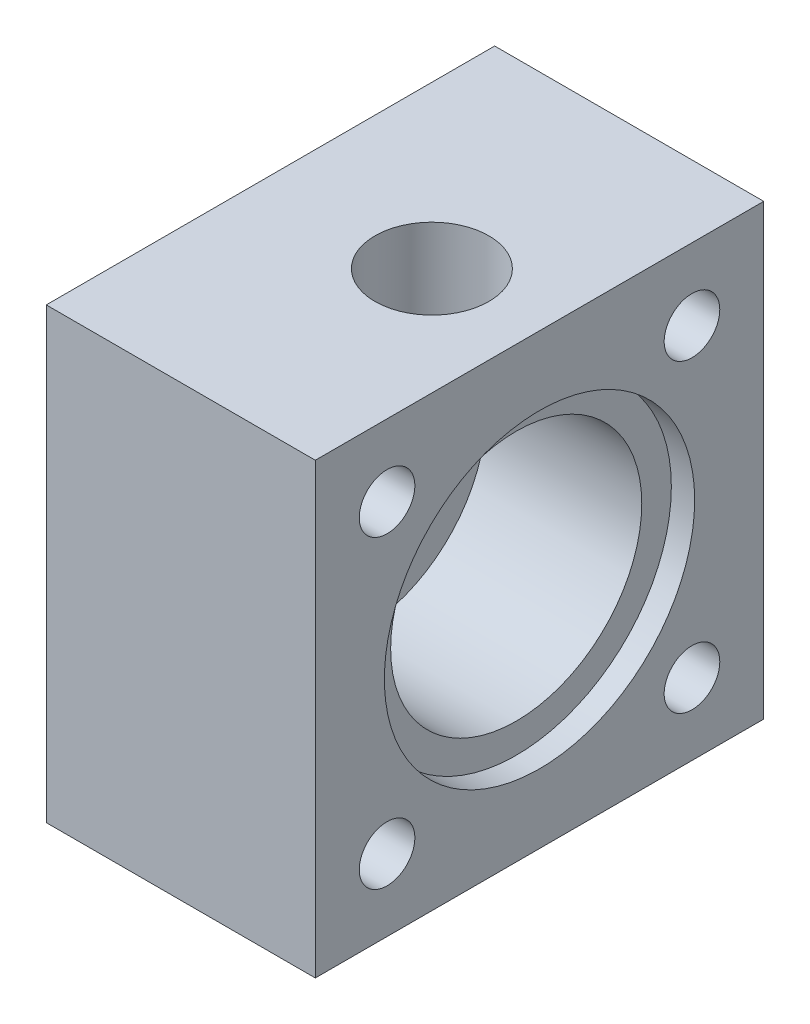
ISO-10303-21;
HEADER;
FILE_DESCRIPTION(('STEP AP214'),'2;1');
FILE_NAME('part.step','',(''),(''),'','','');
FILE_SCHEMA(('AUTOMOTIVE_DESIGN { 1 0 10303 214 1 1 1 1 }'));
ENDSEC;
DATA;
#1=APPLICATION_CONTEXT('core data for automotive mechanical design processes');
#2=APPLICATION_PROTOCOL_DEFINITION('international standard','automotive_design',2000,#1);
#3=PRODUCT_CONTEXT('',#1,'mechanical');
#4=PRODUCT('Part','Part','',(#3));
#5=PRODUCT_RELATED_PRODUCT_CATEGORY('part','',(#4));
#6=PRODUCT_DEFINITION_FORMATION('','',#4);
#7=PRODUCT_DEFINITION_CONTEXT('part definition',#1,'design');
#8=PRODUCT_DEFINITION('design','',#6,#7);
#9=PRODUCT_DEFINITION_SHAPE('','',#8);
#10=(LENGTH_UNIT() NAMED_UNIT(*) SI_UNIT(.MILLI.,.METRE.));
#11=(NAMED_UNIT(*) PLANE_ANGLE_UNIT() SI_UNIT($,.RADIAN.));
#12=(NAMED_UNIT(*) SI_UNIT($,.STERADIAN.) SOLID_ANGLE_UNIT());
#13=UNCERTAINTY_MEASURE_WITH_UNIT(LENGTH_MEASURE(1.E-05),#10,'distance_accuracy_value','');
#14=(GEOMETRIC_REPRESENTATION_CONTEXT(3) GLOBAL_UNCERTAINTY_ASSIGNED_CONTEXT((#13)) GLOBAL_UNIT_ASSIGNED_CONTEXT((#10,
#11,#12)) REPRESENTATION_CONTEXT('',''));
#15=CARTESIAN_POINT('',(0.,0.,0.));
#16=DIRECTION('',(0.,0.,1.));
#17=DIRECTION('',(1.,0.,0.));
#18=AXIS2_PLACEMENT_3D('',#15,#16,#17);
#19=CARTESIAN_POINT('',(-34.7989898732233,12.5,-12.5));
#20=DIRECTION('',(1.,0.,0.));
#21=DIRECTION('',(0.,0.,-1.));
#22=AXIS2_PLACEMENT_3D('',#19,#20,#21);
#23=CYLINDRICAL_SURFACE('',#22,7.);
#24=CARTESIAN_POINT('',(-10.,12.5,-12.5));
#25=DIRECTION('',(-1.,0.,0.));
#26=DIRECTION('',(0.,0.,1.));
#27=AXIS2_PLACEMENT_3D('',#24,#25,#26);
#28=CIRCLE('',#27,7.);
#29=CARTESIAN_POINT('',(-10.,12.5,-5.5));
#30=VERTEX_POINT('',#29);
#31=EDGE_CURVE('E114',#30,#30,#28,.F.);
#32=ORIENTED_EDGE('',*,*,#31,.F.);
#33=EDGE_LOOP('',(#32));
#34=FACE_BOUND('',#33,.T.);
#35=CARTESIAN_POINT('',(-6.,18.7385394925415,-9.325));
#36=CARTESIAN_POINT('',(-5.91610386799211,18.7385406364684,-9.32500112562036));
#37=CARTESIAN_POINT('',(-5.83218366648935,18.740239643632,-9.32833232458642));
#38=CARTESIAN_POINT('',(-5.66498876648413,18.7469672311146,-9.34160729198387));
#39=CARTESIAN_POINT('',(-5.58171446714393,18.7519977265059,-9.35155486378494));
#40=CARTESIAN_POINT('',(-5.3335176981197,18.7718812218528,-9.39122945818825));
#41=CARTESIAN_POINT('',(-5.17042631903366,18.7915256274184,-9.4307880234478));
#42=CARTESIAN_POINT('',(-4.85475304627355,18.8408699223888,-9.53409943967778));
#43=CARTESIAN_POINT('',(-4.70212664919569,18.8705235827429,-9.59774121995534));
#44=CARTESIAN_POINT('',(-4.40971778965708,18.9364644529988,-9.7470790786203));
#45=CARTESIAN_POINT('',(-4.26993392501944,18.9727509374174,-9.8327727454401));
#46=CARTESIAN_POINT('',(-3.99680023929415,19.0508698068265,-10.0305603049041));
#47=CARTESIAN_POINT('',(-3.86451538916021,19.0929110483799,-10.1440421168656));
#48=CARTESIAN_POINT('',(-3.62004797883896,19.17610051866,-10.3912818556442));
#49=CARTESIAN_POINT('',(-3.50787405153648,19.217248357252,-10.5250484447138));
#50=CARTESIAN_POINT('',(-3.30102233361556,19.2966345342633,-10.8177631858517));
#51=CARTESIAN_POINT('',(-3.20758946319898,19.3346024591903,-10.9776711557389));
#52=CARTESIAN_POINT('',(-3.04942348909177,19.4007315468161,-11.3129747107527));
#53=CARTESIAN_POINT('',(-2.98467540045025,19.428897828247,-11.4883621518272));
#54=CARTESIAN_POINT('',(-2.88972322988133,19.4707598978747,-11.8384268062081));
#55=CARTESIAN_POINT('',(-2.85767087726434,19.4852261303561,-12.0125085886879));
#56=CARTESIAN_POINT('',(-2.82299918451949,19.5008895164648,-12.3641382467761));
#57=CARTESIAN_POINT('',(-2.82036552189445,19.5020931269994,-12.5416843935776));
#58=CARTESIAN_POINT('',(-2.84374401253563,19.4915126893525,-12.8815749194122));
#59=CARTESIAN_POINT('',(-2.86771083653734,19.4806559188818,-13.0440947132053));
#60=CARTESIAN_POINT('',(-2.940039272224,19.4485026600832,-13.3625115876838));
#61=CARTESIAN_POINT('',(-2.9884026925936,19.4272053977343,-13.5184081764171));
#62=CARTESIAN_POINT('',(-3.1086471641424,19.3757768892173,-13.8220375228446));
#63=CARTESIAN_POINT('',(-3.18087328586855,19.3455167413511,-13.9696108874705));
#64=CARTESIAN_POINT('',(-3.34641033896809,19.2790245180445,-14.2509287404489));
#65=CARTESIAN_POINT('',(-3.43972899070373,19.2427902572553,-14.3846681390518));
#66=CARTESIAN_POINT('',(-3.65357527259835,19.1644131502193,-14.6460899148341));
#67=CARTESIAN_POINT('',(-3.77569760019884,19.1220294341126,-14.7723972311322));
#68=CARTESIAN_POINT('',(-4.03929871950584,19.0382044482584,-15.0034005259758));
#69=CARTESIAN_POINT('',(-4.18078786350579,18.9967636964715,-15.1080848706277));
#70=CARTESIAN_POINT('',(-4.4870057242652,18.917610515096,-15.2973717185897));
#71=CARTESIAN_POINT('',(-4.65249222905497,18.8801487316257,-15.3808626919477));
#72=CARTESIAN_POINT('',(-4.99731081529836,18.8163439138495,-15.5182113357399));
#73=CARTESIAN_POINT('',(-5.17663075974563,18.7899912611018,-15.572094653218));
#74=CARTESIAN_POINT('',(-5.53022012711717,18.7539138983809,-15.6448539421725));
#75=CARTESIAN_POINT('',(-5.70391416777173,18.7431227935664,-15.6659834164037));
#76=CARTESIAN_POINT('',(-6.05266434981633,18.7363304782862,-15.679349200102));
#77=CARTESIAN_POINT('',(-6.22771981468346,18.7403223386597,-15.6715990461925));
#78=CARTESIAN_POINT('',(-6.55902987896893,18.7615292398175,-15.6294898173899));
#79=CARTESIAN_POINT('',(-6.71564944458995,18.7776336545618,-15.5973637493863));
#80=CARTESIAN_POINT('',(-7.02108053579204,18.8197363500594,-15.5105220536069));
#81=CARTESIAN_POINT('',(-7.16988998074548,18.8457372521806,-15.4558004404282));
#82=CARTESIAN_POINT('',(-7.46306251437412,18.9061212395072,-15.3226174369645));
#83=CARTESIAN_POINT('',(-7.60691816444415,18.9408308992331,-15.2431922495724));
#84=CARTESIAN_POINT('',(-7.88002410284549,19.0143327949822,-15.0637591962524));
#85=CARTESIAN_POINT('',(-8.00926732061615,19.0531269900169,-14.9637414316042));
#86=CARTESIAN_POINT('',(-8.2629307228661,19.1350890885046,-14.7342459614232));
#87=CARTESIAN_POINT('',(-8.38558398518052,19.1783072815864,-14.6028248574766));
#88=CARTESIAN_POINT('',(-8.60751480634046,19.2607602285221,-14.3203708370364));
#89=CARTESIAN_POINT('',(-8.70678844033369,19.2999943129164,-14.1693346342536));
#90=CARTESIAN_POINT('',(-8.87982886419251,19.3706966681239,-13.8493091742254));
#91=CARTESIAN_POINT('',(-8.95330557979237,19.4020755507306,-13.6801420382315));
#92=CARTESIAN_POINT('',(-9.07012358497685,19.4528585507108,-13.3300323772761));
#93=CARTESIAN_POINT('',(-9.11348648763201,19.4722712552371,-13.1490983997421));
#94=CARTESIAN_POINT('',(-9.16577144429048,19.495784227885,-12.7962258408131));
#95=CARTESIAN_POINT('',(-9.17717191704843,19.5009855484988,-12.6247260939098));
#96=CARTESIAN_POINT('',(-9.17214655415366,19.4987053428124,-12.2822418660013));
#97=CARTESIAN_POINT('',(-9.15572736258157,19.4912268447921,-12.1112572717335));
#98=CARTESIAN_POINT('',(-9.09728626346678,19.4650504443428,-11.7831280972855));
#99=CARTESIAN_POINT('',(-9.05651933698908,19.4469031302979,-11.625712061006));
#100=CARTESIAN_POINT('',(-8.95204028870164,19.401572915061,-11.3200943674524));
#101=CARTESIAN_POINT('',(-8.88832426162152,19.3743884760735,-11.1718942835021));
#102=CARTESIAN_POINT('',(-8.7365710579261,19.3119893517679,-10.8813944469654));
#103=CARTESIAN_POINT('',(-8.64755455665187,19.2764641833,-10.7396748199412));
#104=CARTESIAN_POINT('',(-8.44904477283095,19.2014000666242,-10.4725586493925));
#105=CARTESIAN_POINT('',(-8.33954256605182,19.1618593725693,-10.3471692603778));
#106=CARTESIAN_POINT('',(-8.09265090867032,19.0790526965353,-10.1054853716632));
#107=CARTESIAN_POINT('',(-7.95370800294755,19.0357479510465,-9.99078875588783));
#108=CARTESIAN_POINT('',(-7.657344082036,18.9533704671999,-9.78591699877615));
#109=CARTESIAN_POINT('',(-7.49991104957123,18.9143005132266,-9.69575793278194));
#110=CARTESIAN_POINT('',(-7.25223626870396,18.8624560483138,-9.58093656326706));
#111=CARTESIAN_POINT('',(-7.16736105256389,18.8462455635954,-9.54595832085574));
#112=CARTESIAN_POINT('',(-6.99446478255547,18.8167316111232,-9.48336256593609));
#113=CARTESIAN_POINT('',(-6.90644534016596,18.8034266783994,-9.4557413424922));
#114=CARTESIAN_POINT('',(-6.72815299001454,18.7802695855887,-9.40825113348351));
#115=CARTESIAN_POINT('',(-6.63788665669752,18.7704083881858,-9.38836184140396));
#116=CARTESIAN_POINT('',(-6.4556803418493,18.7545023407205,-9.35651136257029));
#117=CARTESIAN_POINT('',(-6.36374165603336,18.7484546555864,-9.34454428588922));
#118=CARTESIAN_POINT('',(-6.22629958415082,18.7424794534841,-9.33275112222099));
#119=CARTESIAN_POINT('',(-6.18110468408352,18.7410037484791,-9.32984590519436));
#120=CARTESIAN_POINT('',(-6.09060886507535,18.7390334420233,-9.32597000642801));
#121=CARTESIAN_POINT('',(-6.04530794249459,18.738538874766,-9.32499939211092));
#122=CARTESIAN_POINT('',(-6.,18.7385394925415,-9.325));
#123=B_SPLINE_CURVE_WITH_KNOTS('',3,(#35,#36,#37,#38,#39,#40,#41,#42,#43,#44,#45,#46,#47,#48,
#49,#50,#51,#52,#53,#54,#55,#56,#57,#58,#59,#60,#61,#62,#63,#64,#65,#66,#67,#68,#69,#70,#71,#72,
#73,#74,#75,#76,#77,#78,#79,#80,#81,#82,#83,#84,#85,#86,#87,#88,#89,#90,#91,#92,#93,#94,#95,#96,
#97,#98,#99,#100,#101,#102,#103,#104,#105,#106,#107,#108,#109,#110,#111,#112,#113,#114,#115,
#116,#117,#118,#119,#120,#121,#122),.UNSPECIFIED.,.T.,.F.,(4,2,2,2,2,2,2,2,2,2,2,2,2,2,2,2,2,2,
2,2,2,2,2,2,2,2,2,2,2,2,2,2,2,2,2,2,2,2,2,2,2,2,2,4),(0.,0.251638222709606,0.503421222827002,
1.00759363018694,1.50946860909899,2.0112887268781,2.54685824130702,3.08265710856855,
3.64689940034438,4.21084658295613,4.74077304804067,5.27044150703138,5.76203973093057,
6.25367440568788,6.75275464672642,7.2520178595491,7.79184690713608,8.33196564885363,
8.8963139289858,9.46017257985412,9.98317854776972,10.5059394001974,10.9858533008556,
11.4658944090093,11.9676987323776,12.4697448354145,13.0218675193149,13.5740828247801,
14.1323223650903,14.6901608344807,15.203358566432,15.716433750301,16.2051037458172,
16.693856938093,17.2049704222535,17.71630708457,18.2697280583897,18.8235107281668,
19.102851596014,19.3820512942489,19.6605126897229,19.9387668243896,20.0746588199993,
20.2105555514827),.UNSPECIFIED.);
#124=CARTESIAN_POINT('',(-6.,18.7385394925415,-9.325));
#125=VERTEX_POINT('',#124);
#126=EDGE_CURVE('E116',#125,#125,#123,.T.);
#127=ORIENTED_EDGE('',*,*,#126,.T.);
#128=EDGE_LOOP('',(#127));
#129=FACE_BOUND('',#128,.T.);
#130=CARTESIAN_POINT('',(-1.3,12.5,-12.5));
#131=DIRECTION('',(1.,0.,0.));
#132=DIRECTION('',(0.,0.,-1.));
#133=AXIS2_PLACEMENT_3D('',#130,#131,#132);
#134=CIRCLE('',#133,7.);
#135=CARTESIAN_POINT('',(-1.3,12.5,-19.5));
#136=VERTEX_POINT('',#135);
#137=EDGE_CURVE('E37',#136,#136,#134,.F.);
#138=ORIENTED_EDGE('',*,*,#137,.F.);
#139=EDGE_LOOP('',(#138));
#140=FACE_BOUND('',#139,.T.);
#141=ADVANCED_FACE('F33',(#34,#129,#140),#23,.F.);
#142=CARTESIAN_POINT('',(-15.,0.,0.));
#143=DIRECTION('',(0.,0.,1.));
#144=DIRECTION('',(1.,0.,0.));
#145=AXIS2_PLACEMENT_3D('',#142,#143,#144);
#146=PLANE('',#145);
#147=DIRECTION('',(0.,-1.,0.));
#148=VECTOR('',#147,1.);
#149=CARTESIAN_POINT('',(0.,0.,0.));
#150=LINE('',#149,#148);
#151=CARTESIAN_POINT('',(0.,25.,0.));
#152=VERTEX_POINT('',#151);
#153=CARTESIAN_POINT('',(0.,0.,0.));
#154=VERTEX_POINT('',#153);
#155=EDGE_CURVE('E101',#152,#154,#150,.T.);
#156=ORIENTED_EDGE('',*,*,#155,.F.);
#157=DIRECTION('',(1.,0.,0.));
#158=VECTOR('',#157,1.);
#159=CARTESIAN_POINT('',(-15.,25.,0.));
#160=LINE('',#159,#158);
#161=CARTESIAN_POINT('',(-15.,25.,0.));
#162=VERTEX_POINT('',#161);
#163=EDGE_CURVE('E12',#162,#152,#160,.T.);
#164=ORIENTED_EDGE('',*,*,#163,.F.);
#165=DIRECTION('',(0.,-1.,0.));
#166=VECTOR('',#165,1.);
#167=CARTESIAN_POINT('',(-15.,0.,0.));
#168=LINE('',#167,#166);
#169=CARTESIAN_POINT('',(-15.,0.,0.));
#170=VERTEX_POINT('',#169);
#171=EDGE_CURVE('E94',#162,#170,#168,.T.);
#172=ORIENTED_EDGE('',*,*,#171,.T.);
#173=DIRECTION('',(1.,0.,0.));
#174=VECTOR('',#173,1.);
#175=CARTESIAN_POINT('',(-15.,0.,0.));
#176=LINE('',#175,#174);
#177=EDGE_CURVE('E77',#170,#154,#176,.T.);
#178=ORIENTED_EDGE('',*,*,#177,.T.);
#179=EDGE_LOOP('',(#156,#164,#172,#178));
#180=FACE_BOUND('',#179,.T.);
#181=ADVANCED_FACE('F35',(#180),#146,.T.);
#182=CARTESIAN_POINT('',(-15.,25.,0.));
#183=DIRECTION('',(0.,1.,0.));
#184=DIRECTION('',(0.,0.,1.));
#185=AXIS2_PLACEMENT_3D('',#182,#183,#184);
#186=PLANE('',#185);
#187=CARTESIAN_POINT('',(-6.,25.,-12.5));
#188=DIRECTION('',(0.,1.,0.));
#189=DIRECTION('',(0.,0.,1.));
#190=AXIS2_PLACEMENT_3D('',#187,#188,#189);
#191=CIRCLE('',#190,3.175);
#192=CARTESIAN_POINT('',(-6.,25.,-9.325));
#193=VERTEX_POINT('',#192);
#194=EDGE_CURVE('E122',#193,#193,#191,.T.);
#195=ORIENTED_EDGE('',*,*,#194,.F.);
#196=EDGE_LOOP('',(#195));
#197=FACE_BOUND('',#196,.T.);
#198=DIRECTION('',(0.,0.,1.));
#199=VECTOR('',#198,1.);
#200=CARTESIAN_POINT('',(0.,25.,0.));
#201=LINE('',#200,#199);
#202=CARTESIAN_POINT('',(0.,25.,-25.));
#203=VERTEX_POINT('',#202);
#204=EDGE_CURVE('E96',#203,#152,#201,.T.);
#205=ORIENTED_EDGE('',*,*,#204,.F.);
#206=DIRECTION('',(1.,0.,0.));
#207=VECTOR('',#206,1.);
#208=CARTESIAN_POINT('',(-15.,25.,-25.));
#209=LINE('',#208,#207);
#210=CARTESIAN_POINT('',(-15.,25.,-25.));
#211=VERTEX_POINT('',#210);
#212=EDGE_CURVE('E43',#211,#203,#209,.T.);
#213=ORIENTED_EDGE('',*,*,#212,.F.);
#214=DIRECTION('',(0.,0.,1.));
#215=VECTOR('',#214,1.);
#216=CARTESIAN_POINT('',(-15.,25.,0.));
#217=LINE('',#216,#215);
#218=EDGE_CURVE('E91',#211,#162,#217,.T.);
#219=ORIENTED_EDGE('',*,*,#218,.T.);
#220=ORIENTED_EDGE('',*,*,#163,.T.);
#221=EDGE_LOOP('',(#205,#213,#219,#220));
#222=FACE_BOUND('',#221,.T.);
#223=ADVANCED_FACE('F150',(#197,#222),#186,.T.);
#224=CARTESIAN_POINT('',(-15.,0.,-25.));
#225=DIRECTION('',(0.,0.,-1.));
#226=DIRECTION('',(-1.,0.,0.));
#227=AXIS2_PLACEMENT_3D('',#224,#225,#226);
#228=PLANE('',#227);
#229=DIRECTION('',(0.,1.,0.));
#230=VECTOR('',#229,1.);
#231=CARTESIAN_POINT('',(0.,0.,-25.));
#232=LINE('',#231,#230);
#233=CARTESIAN_POINT('',(0.,0.,-25.));
#234=VERTEX_POINT('',#233);
#235=EDGE_CURVE('E85',#234,#203,#232,.T.);
#236=ORIENTED_EDGE('',*,*,#235,.F.);
#237=DIRECTION('',(1.,0.,0.));
#238=VECTOR('',#237,1.);
#239=CARTESIAN_POINT('',(-15.,0.,-25.));
#240=LINE('',#239,#238);
#241=CARTESIAN_POINT('',(-15.,0.,-25.));
#242=VERTEX_POINT('',#241);
#243=EDGE_CURVE('E80',#242,#234,#240,.T.);
#244=ORIENTED_EDGE('',*,*,#243,.F.);
#245=DIRECTION('',(0.,1.,0.));
#246=VECTOR('',#245,1.);
#247=CARTESIAN_POINT('',(-15.,0.,-25.));
#248=LINE('',#247,#246);
#249=EDGE_CURVE('E83',#242,#211,#248,.T.);
#250=ORIENTED_EDGE('',*,*,#249,.T.);
#251=ORIENTED_EDGE('',*,*,#212,.T.);
#252=EDGE_LOOP('',(#236,#244,#250,#251));
#253=FACE_BOUND('',#252,.T.);
#254=ADVANCED_FACE('F82',(#253),#228,.T.);
#255=CARTESIAN_POINT('',(-15.,0.,0.));
#256=DIRECTION('',(0.,-1.,0.));
#257=DIRECTION('',(0.,0.,-1.));
#258=AXIS2_PLACEMENT_3D('',#255,#256,#257);
#259=PLANE('',#258);
#260=DIRECTION('',(0.,0.,-1.));
#261=VECTOR('',#260,1.);
#262=CARTESIAN_POINT('',(0.,0.,0.));
#263=LINE('',#262,#261);
#264=EDGE_CURVE('E104',#154,#234,#263,.T.);
#265=ORIENTED_EDGE('',*,*,#264,.F.);
#266=ORIENTED_EDGE('',*,*,#177,.F.);
#267=DIRECTION('',(0.,0.,-1.));
#268=VECTOR('',#267,1.);
#269=CARTESIAN_POINT('',(-15.,0.,0.));
#270=LINE('',#269,#268);
#271=EDGE_CURVE('E90',#170,#242,#270,.T.);
#272=ORIENTED_EDGE('',*,*,#271,.T.);
#273=ORIENTED_EDGE('',*,*,#243,.T.);
#274=EDGE_LOOP('',(#265,#266,#272,#273));
#275=FACE_BOUND('',#274,.T.);
#276=ADVANCED_FACE('F93',(#275),#259,.T.);
#277=CARTESIAN_POINT('',(-15.,25.,0.));
#278=DIRECTION('',(-1.,0.,0.));
#279=DIRECTION('',(0.,0.,1.));
#280=AXIS2_PLACEMENT_3D('',#277,#278,#279);
#281=PLANE('',#280);
#282=CARTESIAN_POINT('',(-15.,12.5,-12.5));
#283=DIRECTION('',(1.,0.,0.));
#284=DIRECTION('',(0.,0.,-1.));
#285=AXIS2_PLACEMENT_3D('',#282,#283,#284);
#286=CIRCLE('',#285,3.175);
#287=CARTESIAN_POINT('',(-15.,12.5,-15.675));
#288=VERTEX_POINT('',#287);
#289=EDGE_CURVE('E115',#288,#288,#286,.T.);
#290=ORIENTED_EDGE('',*,*,#289,.T.);
#291=EDGE_LOOP('',(#290));
#292=FACE_BOUND('',#291,.T.);
#293=CARTESIAN_POINT('',(-15.,4.,-21.));
#294=DIRECTION('',(1.,0.,0.));
#295=DIRECTION('',(0.,0.,-1.));
#296=AXIS2_PLACEMENT_3D('',#293,#294,#295);
#297=CIRCLE('',#296,1.55);
#298=CARTESIAN_POINT('',(-15.,4.,-22.55));
#299=VERTEX_POINT('',#298);
#300=EDGE_CURVE('E174',#299,#299,#297,.T.);
#301=ORIENTED_EDGE('',*,*,#300,.T.);
#302=EDGE_LOOP('',(#301));
#303=FACE_BOUND('',#302,.T.);
#304=CARTESIAN_POINT('',(-15.,21.,-21.));
#305=DIRECTION('',(1.,0.,0.));
#306=DIRECTION('',(0.,0.,-1.));
#307=AXIS2_PLACEMENT_3D('',#304,#305,#306);
#308=CIRCLE('',#307,1.55);
#309=CARTESIAN_POINT('',(-15.,21.,-22.55));
#310=VERTEX_POINT('',#309);
#311=EDGE_CURVE('E180',#310,#310,#308,.T.);
#312=ORIENTED_EDGE('',*,*,#311,.T.);
#313=EDGE_LOOP('',(#312));
#314=FACE_BOUND('',#313,.T.);
#315=CARTESIAN_POINT('',(-15.,21.,-4.));
#316=DIRECTION('',(1.,0.,0.));
#317=DIRECTION('',(0.,0.,-1.));
#318=AXIS2_PLACEMENT_3D('',#315,#316,#317);
#319=CIRCLE('',#318,1.55);
#320=CARTESIAN_POINT('',(-15.,21.,-5.55));
#321=VERTEX_POINT('',#320);
#322=EDGE_CURVE('E186',#321,#321,#319,.T.);
#323=ORIENTED_EDGE('',*,*,#322,.T.);
#324=EDGE_LOOP('',(#323));
#325=FACE_BOUND('',#324,.T.);
#326=CARTESIAN_POINT('',(-15.,4.,-4.));
#327=DIRECTION('',(1.,0.,0.));
#328=DIRECTION('',(0.,0.,-1.));
#329=AXIS2_PLACEMENT_3D('',#326,#327,#328);
#330=CIRCLE('',#329,1.55);
#331=CARTESIAN_POINT('',(-15.,4.,-5.55));
#332=VERTEX_POINT('',#331);
#333=EDGE_CURVE('E105',#332,#332,#330,.T.);
#334=ORIENTED_EDGE('',*,*,#333,.T.);
#335=EDGE_LOOP('',(#334));
#336=FACE_BOUND('',#335,.T.);
#337=ORIENTED_EDGE('',*,*,#171,.F.);
#338=ORIENTED_EDGE('',*,*,#218,.F.);
#339=ORIENTED_EDGE('',*,*,#249,.F.);
#340=ORIENTED_EDGE('',*,*,#271,.F.);
#341=EDGE_LOOP('',(#337,#338,#339,#340));
#342=FACE_BOUND('',#341,.T.);
#343=ADVANCED_FACE('F89',(#292,#303,#314,#325,#336,#342),#281,.T.);
#344=CARTESIAN_POINT('',(0.,25.,0.));
#345=DIRECTION('',(-1.,0.,0.));
#346=DIRECTION('',(0.,0.,1.));
#347=AXIS2_PLACEMENT_3D('',#344,#345,#346);
#348=PLANE('',#347);
#349=CARTESIAN_POINT('',(0.,12.5,-12.5));
#350=DIRECTION('',(1.,0.,0.));
#351=DIRECTION('',(0.,0.,-1.));
#352=AXIS2_PLACEMENT_3D('',#349,#350,#351);
#353=CIRCLE('',#352,8.65);
#354=CARTESIAN_POINT('',(0.,12.5,-21.15));
#355=VERTEX_POINT('',#354);
#356=EDGE_CURVE('E163',#355,#355,#353,.T.);
#357=ORIENTED_EDGE('',*,*,#356,.F.);
#358=EDGE_LOOP('',(#357));
#359=FACE_BOUND('',#358,.T.);
#360=CARTESIAN_POINT('',(0.,4.,-21.));
#361=DIRECTION('',(1.,0.,0.));
#362=DIRECTION('',(0.,0.,-1.));
#363=AXIS2_PLACEMENT_3D('',#360,#361,#362);
#364=CIRCLE('',#363,1.55);
#365=CARTESIAN_POINT('',(0.,4.,-22.55));
#366=VERTEX_POINT('',#365);
#367=EDGE_CURVE('E173',#366,#366,#364,.T.);
#368=ORIENTED_EDGE('',*,*,#367,.F.);
#369=EDGE_LOOP('',(#368));
#370=FACE_BOUND('',#369,.T.);
#371=CARTESIAN_POINT('',(0.,21.,-21.));
#372=DIRECTION('',(1.,0.,0.));
#373=DIRECTION('',(0.,0.,-1.));
#374=AXIS2_PLACEMENT_3D('',#371,#372,#373);
#375=CIRCLE('',#374,1.55);
#376=CARTESIAN_POINT('',(0.,21.,-22.55));
#377=VERTEX_POINT('',#376);
#378=EDGE_CURVE('E177',#377,#377,#375,.T.);
#379=ORIENTED_EDGE('',*,*,#378,.F.);
#380=EDGE_LOOP('',(#379));
#381=FACE_BOUND('',#380,.T.);
#382=CARTESIAN_POINT('',(0.,21.,-4.));
#383=DIRECTION('',(1.,0.,0.));
#384=DIRECTION('',(0.,0.,-1.));
#385=AXIS2_PLACEMENT_3D('',#382,#383,#384);
#386=CIRCLE('',#385,1.55);
#387=CARTESIAN_POINT('',(0.,21.,-5.55));
#388=VERTEX_POINT('',#387);
#389=EDGE_CURVE('E183',#388,#388,#386,.T.);
#390=ORIENTED_EDGE('',*,*,#389,.F.);
#391=EDGE_LOOP('',(#390));
#392=FACE_BOUND('',#391,.T.);
#393=CARTESIAN_POINT('',(0.,4.,-4.));
#394=DIRECTION('',(1.,0.,0.));
#395=DIRECTION('',(0.,0.,-1.));
#396=AXIS2_PLACEMENT_3D('',#393,#394,#395);
#397=CIRCLE('',#396,1.55);
#398=CARTESIAN_POINT('',(0.,4.,-5.55));
#399=VERTEX_POINT('',#398);
#400=EDGE_CURVE('E189',#399,#399,#397,.T.);
#401=ORIENTED_EDGE('',*,*,#400,.F.);
#402=EDGE_LOOP('',(#401));
#403=FACE_BOUND('',#402,.T.);
#404=ORIENTED_EDGE('',*,*,#155,.T.);
#405=ORIENTED_EDGE('',*,*,#264,.T.);
#406=ORIENTED_EDGE('',*,*,#235,.T.);
#407=ORIENTED_EDGE('',*,*,#204,.T.);
#408=EDGE_LOOP('',(#404,#405,#406,#407));
#409=FACE_BOUND('',#408,.T.);
#410=ADVANCED_FACE('F198',(#359,#370,#381,#392,#403,#409),#348,.F.);
#411=CARTESIAN_POINT('',(-15.,4.,-4.));
#412=DIRECTION('',(1.,0.,0.));
#413=DIRECTION('',(0.,0.,-1.));
#414=AXIS2_PLACEMENT_3D('',#411,#412,#413);
#415=CYLINDRICAL_SURFACE('',#414,1.55);
#416=ORIENTED_EDGE('',*,*,#333,.F.);
#417=EDGE_LOOP('',(#416));
#418=FACE_BOUND('',#417,.T.);
#419=ORIENTED_EDGE('',*,*,#400,.T.);
#420=EDGE_LOOP('',(#419));
#421=FACE_BOUND('',#420,.T.);
#422=ADVANCED_FACE('F196',(#418,#421),#415,.F.);
#423=CARTESIAN_POINT('',(-15.,21.,-4.));
#424=DIRECTION('',(1.,0.,0.));
#425=DIRECTION('',(0.,0.,-1.));
#426=AXIS2_PLACEMENT_3D('',#423,#424,#425);
#427=CYLINDRICAL_SURFACE('',#426,1.55);
#428=ORIENTED_EDGE('',*,*,#322,.F.);
#429=EDGE_LOOP('',(#428));
#430=FACE_BOUND('',#429,.T.);
#431=ORIENTED_EDGE('',*,*,#389,.T.);
#432=EDGE_LOOP('',(#431));
#433=FACE_BOUND('',#432,.T.);
#434=ADVANCED_FACE('F223',(#430,#433),#427,.F.);
#435=CARTESIAN_POINT('',(-15.,21.,-21.));
#436=DIRECTION('',(1.,0.,0.));
#437=DIRECTION('',(0.,0.,-1.));
#438=AXIS2_PLACEMENT_3D('',#435,#436,#437);
#439=CYLINDRICAL_SURFACE('',#438,1.55);
#440=ORIENTED_EDGE('',*,*,#311,.F.);
#441=EDGE_LOOP('',(#440));
#442=FACE_BOUND('',#441,.T.);
#443=ORIENTED_EDGE('',*,*,#378,.T.);
#444=EDGE_LOOP('',(#443));
#445=FACE_BOUND('',#444,.T.);
#446=ADVANCED_FACE('F227',(#442,#445),#439,.F.);
#447=CARTESIAN_POINT('',(-15.,4.,-21.));
#448=DIRECTION('',(1.,0.,0.));
#449=DIRECTION('',(0.,0.,-1.));
#450=AXIS2_PLACEMENT_3D('',#447,#448,#449);
#451=CYLINDRICAL_SURFACE('',#450,1.55);
#452=ORIENTED_EDGE('',*,*,#300,.F.);
#453=EDGE_LOOP('',(#452));
#454=FACE_BOUND('',#453,.T.);
#455=ORIENTED_EDGE('',*,*,#367,.T.);
#456=EDGE_LOOP('',(#455));
#457=FACE_BOUND('',#456,.T.);
#458=ADVANCED_FACE('F141',(#454,#457),#451,.F.);
#459=CARTESIAN_POINT('',(-10.,25.,0.));
#460=DIRECTION('',(-1.,0.,0.));
#461=DIRECTION('',(0.,0.,1.));
#462=AXIS2_PLACEMENT_3D('',#459,#460,#461);
#463=PLANE('',#462);
#464=CARTESIAN_POINT('',(-10.,12.5,-12.5));
#465=DIRECTION('',(-1.,0.,0.));
#466=DIRECTION('',(0.,0.,1.));
#467=AXIS2_PLACEMENT_3D('',#464,#465,#466);
#468=CIRCLE('',#467,3.175);
#469=CARTESIAN_POINT('',(-10.,12.5,-9.325));
#470=VERTEX_POINT('',#469);
#471=EDGE_CURVE('E112',#470,#470,#468,.T.);
#472=ORIENTED_EDGE('',*,*,#471,.T.);
#473=EDGE_LOOP('',(#472));
#474=FACE_BOUND('',#473,.T.);
#475=ORIENTED_EDGE('',*,*,#31,.T.);
#476=EDGE_LOOP('',(#475));
#477=FACE_BOUND('',#476,.T.);
#478=ADVANCED_FACE('F136',(#474,#477),#463,.F.);
#479=CARTESIAN_POINT('',(-15.,12.5,-12.5));
#480=DIRECTION('',(1.,0.,0.));
#481=DIRECTION('',(0.,0.,-1.));
#482=AXIS2_PLACEMENT_3D('',#479,#480,#481);
#483=CYLINDRICAL_SURFACE('',#482,3.175);
#484=ORIENTED_EDGE('',*,*,#289,.F.);
#485=EDGE_LOOP('',(#484));
#486=FACE_BOUND('',#485,.T.);
#487=ORIENTED_EDGE('',*,*,#471,.F.);
#488=EDGE_LOOP('',(#487));
#489=FACE_BOUND('',#488,.T.);
#490=ADVANCED_FACE('F131',(#486,#489),#483,.F.);
#491=CARTESIAN_POINT('',(-6.,15.,-12.5));
#492=DIRECTION('',(0.,1.,0.));
#493=DIRECTION('',(0.,0.,1.));
#494=AXIS2_PLACEMENT_3D('',#491,#492,#493);
#495=CYLINDRICAL_SURFACE('',#494,3.175);
#496=ORIENTED_EDGE('',*,*,#194,.T.);
#497=EDGE_LOOP('',(#496));
#498=FACE_BOUND('',#497,.T.);
#499=ORIENTED_EDGE('',*,*,#126,.F.);
#500=EDGE_LOOP('',(#499));
#501=FACE_BOUND('',#500,.T.);
#502=ADVANCED_FACE('F126',(#498,#501),#495,.F.);
#503=CARTESIAN_POINT('',(-1.3,12.5,-12.5));
#504=DIRECTION('',(1.,0.,0.));
#505=DIRECTION('',(0.,0.,-1.));
#506=AXIS2_PLACEMENT_3D('',#503,#504,#505);
#507=PLANE('',#506);
#508=CARTESIAN_POINT('',(-1.3,12.5,-12.5));
#509=DIRECTION('',(1.,0.,0.));
#510=DIRECTION('',(0.,0.,-1.));
#511=AXIS2_PLACEMENT_3D('',#508,#509,#510);
#512=CIRCLE('',#511,8.65);
#513=CARTESIAN_POINT('',(-1.3,12.5,-21.15));
#514=VERTEX_POINT('',#513);
#515=EDGE_CURVE('E159',#514,#514,#512,.T.);
#516=ORIENTED_EDGE('',*,*,#515,.T.);
#517=EDGE_LOOP('',(#516));
#518=FACE_BOUND('',#517,.T.);
#519=ORIENTED_EDGE('',*,*,#137,.T.);
#520=EDGE_LOOP('',(#519));
#521=FACE_BOUND('',#520,.T.);
#522=ADVANCED_FACE('F130',(#518,#521),#507,.T.);
#523=CARTESIAN_POINT('',(-1.3,12.5,-12.5));
#524=DIRECTION('',(1.,0.,0.));
#525=DIRECTION('',(0.,0.,-1.));
#526=AXIS2_PLACEMENT_3D('',#523,#524,#525);
#527=CYLINDRICAL_SURFACE('',#526,8.65);
#528=ORIENTED_EDGE('',*,*,#515,.F.);
#529=EDGE_LOOP('',(#528));
#530=FACE_BOUND('',#529,.T.);
#531=ORIENTED_EDGE('',*,*,#356,.T.);
#532=EDGE_LOOP('',(#531));
#533=FACE_BOUND('',#532,.T.);
#534=ADVANCED_FACE('F133',(#530,#533),#527,.F.);
#535=CLOSED_SHELL('',(#141,#181,#223,#254,#276,#343,#410,#422,#434,#446,#458,#478,#490,#502,
#522,#534));
#536=MANIFOLD_SOLID_BREP('B2',#535);
#537=ADVANCED_BREP_SHAPE_REPRESENTATION('',(#18,#536),#14);
#538=SHAPE_DEFINITION_REPRESENTATION(#9,#537);
ENDSEC;
END-ISO-10303-21;
